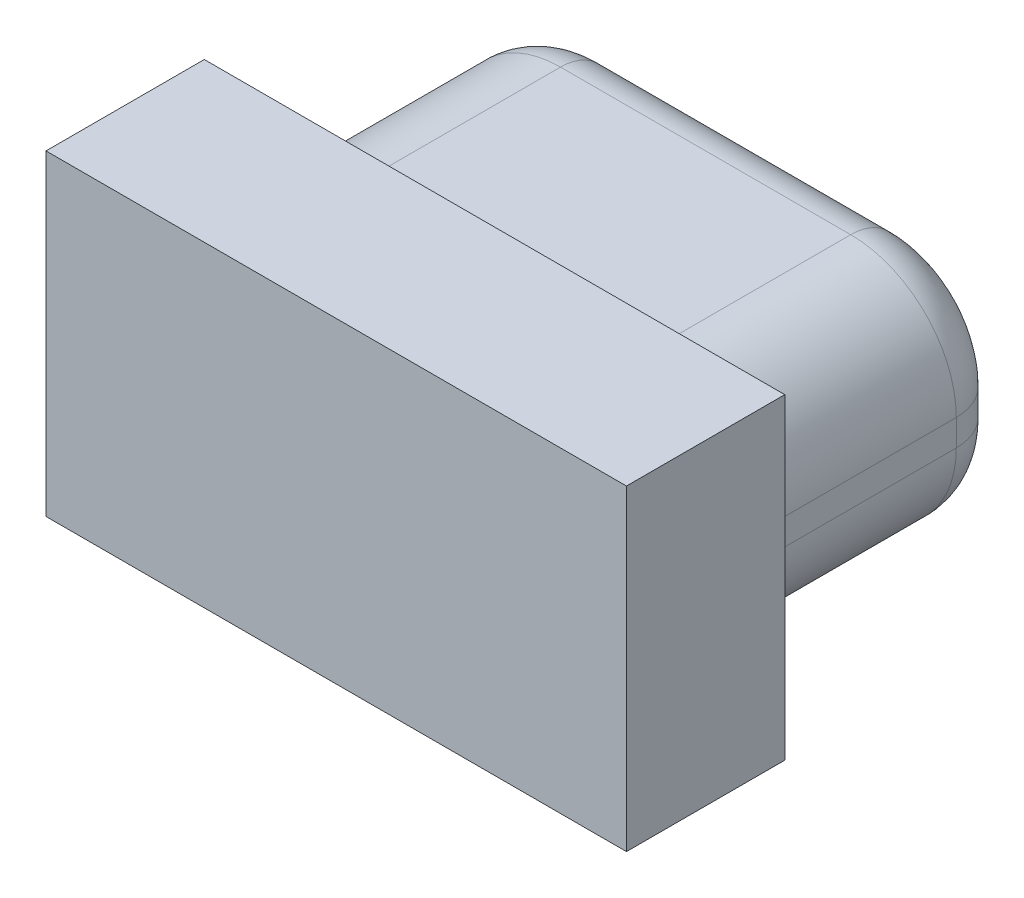
ISO-10303-21;
HEADER;
FILE_DESCRIPTION(('STEP AP214'),'2;1');
FILE_NAME('part.step','',(''),(''),'','','');
FILE_SCHEMA(('AUTOMOTIVE_DESIGN { 1 0 10303 214 1 1 1 1 }'));
ENDSEC;
DATA;
#1=APPLICATION_CONTEXT('core data for automotive mechanical design processes');
#2=APPLICATION_PROTOCOL_DEFINITION('international standard','automotive_design',2000,#1);
#3=PRODUCT_CONTEXT('',#1,'mechanical');
#4=PRODUCT('Part','Part','',(#3));
#5=PRODUCT_RELATED_PRODUCT_CATEGORY('part','',(#4));
#6=PRODUCT_DEFINITION_FORMATION('','',#4);
#7=PRODUCT_DEFINITION_CONTEXT('part definition',#1,'design');
#8=PRODUCT_DEFINITION('design','',#6,#7);
#9=PRODUCT_DEFINITION_SHAPE('','',#8);
#10=(LENGTH_UNIT() NAMED_UNIT(*) SI_UNIT(.MILLI.,.METRE.));
#11=(NAMED_UNIT(*) PLANE_ANGLE_UNIT() SI_UNIT($,.RADIAN.));
#12=(NAMED_UNIT(*) SI_UNIT($,.STERADIAN.) SOLID_ANGLE_UNIT());
#13=UNCERTAINTY_MEASURE_WITH_UNIT(LENGTH_MEASURE(1.E-05),#10,'distance_accuracy_value','');
#14=(GEOMETRIC_REPRESENTATION_CONTEXT(3) GLOBAL_UNCERTAINTY_ASSIGNED_CONTEXT((#13)) GLOBAL_UNIT_ASSIGNED_CONTEXT((#10,
#11,#12)) REPRESENTATION_CONTEXT('',''));
#15=CARTESIAN_POINT('',(0.,0.,0.));
#16=DIRECTION('',(0.,0.,1.));
#17=DIRECTION('',(1.,0.,0.));
#18=AXIS2_PLACEMENT_3D('',#15,#16,#17);
#19=CARTESIAN_POINT('',(0.,0.,5.));
#20=DIRECTION('',(1.,0.,0.));
#21=DIRECTION('',(0.,0.,-1.));
#22=AXIS2_PLACEMENT_3D('',#19,#20,#21);
#23=PLANE('',#22);
#24=DIRECTION('',(0.,0.,-1.));
#25=VECTOR('',#24,1.);
#26=CARTESIAN_POINT('',(0.,2.5,5.));
#27=LINE('',#26,#25);
#28=CARTESIAN_POINT('',(0.,2.5,5.));
#29=VERTEX_POINT('',#28);
#30=CARTESIAN_POINT('',(0.,2.5,1.));
#31=VERTEX_POINT('',#30);
#32=EDGE_CURVE('E195',#29,#31,#27,.T.);
#33=ORIENTED_EDGE('',*,*,#32,.T.);
#34=DIRECTION('',(0.,-1.,0.));
#35=VECTOR('',#34,1.);
#36=CARTESIAN_POINT('',(0.,2.,1.));
#37=LINE('',#36,#35);
#38=CARTESIAN_POINT('',(0.,2.,1.));
#39=VERTEX_POINT('',#38);
#40=EDGE_CURVE('E239',#31,#39,#37,.T.);
#41=ORIENTED_EDGE('',*,*,#40,.T.);
#42=DIRECTION('',(0.,0.,-1.));
#43=VECTOR('',#42,1.);
#44=CARTESIAN_POINT('',(0.,2.,5.));
#45=LINE('',#44,#43);
#46=CARTESIAN_POINT('',(0.,2.,5.));
#47=VERTEX_POINT('',#46);
#48=EDGE_CURVE('E193',#39,#47,#45,.F.);
#49=ORIENTED_EDGE('',*,*,#48,.T.);
#50=DIRECTION('',(0.,-1.,0.));
#51=VECTOR('',#50,1.);
#52=CARTESIAN_POINT('',(0.,0.,5.));
#53=LINE('',#52,#51);
#54=EDGE_CURVE('E176',#29,#47,#53,.T.);
#55=ORIENTED_EDGE('',*,*,#54,.F.);
#56=EDGE_LOOP('',(#33,#41,#49,#55));
#57=FACE_BOUND('',#56,.T.);
#58=ADVANCED_FACE('F37',(#57),#23,.F.);
#59=CARTESIAN_POINT('',(0.,0.,5.));
#60=DIRECTION('',(0.,1.,0.));
#61=DIRECTION('',(0.,0.,1.));
#62=AXIS2_PLACEMENT_3D('',#59,#60,#61);
#63=PLANE('',#62);
#64=DIRECTION('',(0.,0.,-1.));
#65=VECTOR('',#64,1.);
#66=CARTESIAN_POINT('',(2.,0.,5.));
#67=LINE('',#66,#65);
#68=CARTESIAN_POINT('',(2.,0.,5.));
#69=VERTEX_POINT('',#68);
#70=CARTESIAN_POINT('',(2.,0.,1.));
#71=VERTEX_POINT('',#70);
#72=EDGE_CURVE('E207',#69,#71,#67,.T.);
#73=ORIENTED_EDGE('',*,*,#72,.T.);
#74=DIRECTION('',(1.,0.,0.));
#75=VECTOR('',#74,1.);
#76=CARTESIAN_POINT('',(7.5,0.,1.));
#77=LINE('',#76,#75);
#78=CARTESIAN_POINT('',(7.5,0.,1.));
#79=VERTEX_POINT('',#78);
#80=EDGE_CURVE('E11',#71,#79,#77,.T.);
#81=ORIENTED_EDGE('',*,*,#80,.T.);
#82=DIRECTION('',(0.,0.,-1.));
#83=VECTOR('',#82,1.);
#84=CARTESIAN_POINT('',(7.5,0.,5.));
#85=LINE('',#84,#83);
#86=CARTESIAN_POINT('',(7.5,0.,5.));
#87=VERTEX_POINT('',#86);
#88=EDGE_CURVE('E209',#79,#87,#85,.F.);
#89=ORIENTED_EDGE('',*,*,#88,.T.);
#90=DIRECTION('',(1.,0.,0.));
#91=VECTOR('',#90,1.);
#92=CARTESIAN_POINT('',(0.,0.,5.));
#93=LINE('',#92,#91);
#94=EDGE_CURVE('E179',#69,#87,#93,.T.);
#95=ORIENTED_EDGE('',*,*,#94,.F.);
#96=EDGE_LOOP('',(#73,#81,#89,#95));
#97=FACE_BOUND('',#96,.T.);
#98=ADVANCED_FACE('F306',(#97),#63,.F.);
#99=CARTESIAN_POINT('',(9.5,0.,5.));
#100=DIRECTION('',(-1.,0.,0.));
#101=DIRECTION('',(0.,0.,1.));
#102=AXIS2_PLACEMENT_3D('',#99,#100,#101);
#103=PLANE('',#102);
#104=DIRECTION('',(0.,0.,-1.));
#105=VECTOR('',#104,1.);
#106=CARTESIAN_POINT('',(9.5,2.,5.));
#107=LINE('',#106,#105);
#108=CARTESIAN_POINT('',(9.5,2.,5.));
#109=VERTEX_POINT('',#108);
#110=CARTESIAN_POINT('',(9.5,2.,1.));
#111=VERTEX_POINT('',#110);
#112=EDGE_CURVE('E203',#109,#111,#107,.T.);
#113=ORIENTED_EDGE('',*,*,#112,.T.);
#114=DIRECTION('',(0.,1.,0.));
#115=VECTOR('',#114,1.);
#116=CARTESIAN_POINT('',(9.5,2.5,1.));
#117=LINE('',#116,#115);
#118=CARTESIAN_POINT('',(9.5,2.5,1.));
#119=VERTEX_POINT('',#118);
#120=EDGE_CURVE('E247',#111,#119,#117,.T.);
#121=ORIENTED_EDGE('',*,*,#120,.T.);
#122=DIRECTION('',(0.,0.,-1.));
#123=VECTOR('',#122,1.);
#124=CARTESIAN_POINT('',(9.5,2.5,5.));
#125=LINE('',#124,#123);
#126=CARTESIAN_POINT('',(9.5,2.5,5.));
#127=VERTEX_POINT('',#126);
#128=EDGE_CURVE('E205',#119,#127,#125,.F.);
#129=ORIENTED_EDGE('',*,*,#128,.T.);
#130=DIRECTION('',(0.,1.,0.));
#131=VECTOR('',#130,1.);
#132=CARTESIAN_POINT('',(9.5,0.,5.));
#133=LINE('',#132,#131);
#134=EDGE_CURVE('E187',#109,#127,#133,.T.);
#135=ORIENTED_EDGE('',*,*,#134,.F.);
#136=EDGE_LOOP('',(#113,#121,#129,#135));
#137=FACE_BOUND('',#136,.T.);
#138=ADVANCED_FACE('F312',(#137),#103,.F.);
#139=CARTESIAN_POINT('',(0.,4.5,5.));
#140=DIRECTION('',(0.,-1.,0.));
#141=DIRECTION('',(0.,0.,-1.));
#142=AXIS2_PLACEMENT_3D('',#139,#140,#141);
#143=PLANE('',#142);
#144=DIRECTION('',(0.,0.,-1.));
#145=VECTOR('',#144,1.);
#146=CARTESIAN_POINT('',(7.5,4.5,5.));
#147=LINE('',#146,#145);
#148=CARTESIAN_POINT('',(7.5,4.5,5.));
#149=VERTEX_POINT('',#148);
#150=CARTESIAN_POINT('',(7.5,4.5,1.));
#151=VERTEX_POINT('',#150);
#152=EDGE_CURVE('E198',#149,#151,#147,.T.);
#153=ORIENTED_EDGE('',*,*,#152,.T.);
#154=DIRECTION('',(-1.,0.,0.));
#155=VECTOR('',#154,1.);
#156=CARTESIAN_POINT('',(2.,4.5,1.));
#157=LINE('',#156,#155);
#158=CARTESIAN_POINT('',(2.,4.5,1.));
#159=VERTEX_POINT('',#158);
#160=EDGE_CURVE('E243',#151,#159,#157,.T.);
#161=ORIENTED_EDGE('',*,*,#160,.T.);
#162=DIRECTION('',(0.,0.,-1.));
#163=VECTOR('',#162,1.);
#164=CARTESIAN_POINT('',(2.,4.5,5.));
#165=LINE('',#164,#163);
#166=CARTESIAN_POINT('',(2.,4.5,5.));
#167=VERTEX_POINT('',#166);
#168=EDGE_CURVE('E201',#159,#167,#165,.F.);
#169=ORIENTED_EDGE('',*,*,#168,.T.);
#170=DIRECTION('',(-1.,0.,0.));
#171=VECTOR('',#170,1.);
#172=CARTESIAN_POINT('',(0.,4.5,5.));
#173=LINE('',#172,#171);
#174=EDGE_CURVE('E190',#149,#167,#173,.T.);
#175=ORIENTED_EDGE('',*,*,#174,.F.);
#176=EDGE_LOOP('',(#153,#161,#169,#175));
#177=FACE_BOUND('',#176,.T.);
#178=ADVANCED_FACE('F367',(#177),#143,.F.);
#179=CARTESIAN_POINT('',(0.,0.,0.));
#180=DIRECTION('',(0.,0.,-1.));
#181=DIRECTION('',(-1.,0.,0.));
#182=AXIS2_PLACEMENT_3D('',#179,#180,#181);
#183=PLANE('',#182);
#184=DIRECTION('',(1.,0.,0.));
#185=VECTOR('',#184,1.);
#186=CARTESIAN_POINT('',(2.,1.,0.));
#187=LINE('',#186,#185);
#188=CARTESIAN_POINT('',(7.5,1.,0.));
#189=VERTEX_POINT('',#188);
#190=CARTESIAN_POINT('',(2.,1.,0.));
#191=VERTEX_POINT('',#190);
#192=EDGE_CURVE('E219',#189,#191,#187,.F.);
#193=ORIENTED_EDGE('',*,*,#192,.T.);
#194=CARTESIAN_POINT('',(2.,2.,0.));
#195=DIRECTION('',(0.,0.,-1.));
#196=DIRECTION('',(-1.,0.,0.));
#197=AXIS2_PLACEMENT_3D('',#194,#195,#196);
#198=CIRCLE('',#197,1.);
#199=CARTESIAN_POINT('',(1.,2.,0.));
#200=VERTEX_POINT('',#199);
#201=EDGE_CURVE('E233',#191,#200,#198,.T.);
#202=ORIENTED_EDGE('',*,*,#201,.T.);
#203=DIRECTION('',(0.,-1.,0.));
#204=VECTOR('',#203,1.);
#205=CARTESIAN_POINT('',(1.,2.5,0.));
#206=LINE('',#205,#204);
#207=CARTESIAN_POINT('',(1.,2.5,0.));
#208=VERTEX_POINT('',#207);
#209=EDGE_CURVE('E231',#200,#208,#206,.F.);
#210=ORIENTED_EDGE('',*,*,#209,.T.);
#211=CARTESIAN_POINT('',(2.,2.5,0.));
#212=DIRECTION('',(0.,0.,-1.));
#213=DIRECTION('',(-1.,0.,0.));
#214=AXIS2_PLACEMENT_3D('',#211,#212,#213);
#215=CIRCLE('',#214,1.);
#216=CARTESIAN_POINT('',(2.,3.5,0.));
#217=VERTEX_POINT('',#216);
#218=EDGE_CURVE('E229',#208,#217,#215,.T.);
#219=ORIENTED_EDGE('',*,*,#218,.T.);
#220=DIRECTION('',(-1.,0.,0.));
#221=VECTOR('',#220,1.);
#222=CARTESIAN_POINT('',(7.5,3.5,0.));
#223=LINE('',#222,#221);
#224=CARTESIAN_POINT('',(7.5,3.5,0.));
#225=VERTEX_POINT('',#224);
#226=EDGE_CURVE('E227',#217,#225,#223,.F.);
#227=ORIENTED_EDGE('',*,*,#226,.T.);
#228=CARTESIAN_POINT('',(7.5,2.5,0.));
#229=DIRECTION('',(0.,0.,-1.));
#230=DIRECTION('',(-1.,0.,0.));
#231=AXIS2_PLACEMENT_3D('',#228,#229,#230);
#232=CIRCLE('',#231,1.);
#233=CARTESIAN_POINT('',(8.5,2.5,0.));
#234=VERTEX_POINT('',#233);
#235=EDGE_CURVE('E225',#225,#234,#232,.T.);
#236=ORIENTED_EDGE('',*,*,#235,.T.);
#237=DIRECTION('',(0.,1.,0.));
#238=VECTOR('',#237,1.);
#239=CARTESIAN_POINT('',(8.5,2.,0.));
#240=LINE('',#239,#238);
#241=CARTESIAN_POINT('',(8.5,2.,0.));
#242=VERTEX_POINT('',#241);
#243=EDGE_CURVE('E223',#234,#242,#240,.F.);
#244=ORIENTED_EDGE('',*,*,#243,.T.);
#245=CARTESIAN_POINT('',(7.5,2.,0.));
#246=DIRECTION('',(0.,0.,-1.));
#247=DIRECTION('',(-1.,0.,0.));
#248=AXIS2_PLACEMENT_3D('',#245,#246,#247);
#249=CIRCLE('',#248,1.);
#250=EDGE_CURVE('E221',#242,#189,#249,.T.);
#251=ORIENTED_EDGE('',*,*,#250,.T.);
#252=EDGE_LOOP('',(#193,#202,#210,#219,#227,#236,#244,#251));
#253=FACE_BOUND('',#252,.T.);
#254=ADVANCED_FACE('F385',(#253),#183,.T.);
#255=CARTESIAN_POINT('',(0.,0.,5.));
#256=DIRECTION('',(0.,0.,1.));
#257=DIRECTION('',(1.,0.,0.));
#258=AXIS2_PLACEMENT_3D('',#255,#256,#257);
#259=PLANE('',#258);
#260=DIRECTION('',(0.,-1.,0.));
#261=VECTOR('',#260,1.);
#262=CARTESIAN_POINT('',(-0.75,5.25,5.));
#263=LINE('',#262,#261);
#264=CARTESIAN_POINT('',(-0.75,5.25,5.));
#265=VERTEX_POINT('',#264);
#266=CARTESIAN_POINT('',(-0.749999999999999,-0.750000000000001,5.));
#267=VERTEX_POINT('',#266);
#268=EDGE_CURVE('E175',#265,#267,#263,.T.);
#269=ORIENTED_EDGE('',*,*,#268,.F.);
#270=DIRECTION('',(-1.,0.,0.));
#271=VECTOR('',#270,1.);
#272=CARTESIAN_POINT('',(-0.75,5.25,5.));
#273=LINE('',#272,#271);
#274=CARTESIAN_POINT('',(10.25,5.25,5.));
#275=VERTEX_POINT('',#274);
#276=EDGE_CURVE('E171',#275,#265,#273,.T.);
#277=ORIENTED_EDGE('',*,*,#276,.F.);
#278=DIRECTION('',(0.,1.,0.));
#279=VECTOR('',#278,1.);
#280=CARTESIAN_POINT('',(10.25,5.25,5.));
#281=LINE('',#280,#279);
#282=CARTESIAN_POINT('',(10.25,-0.750000000000001,5.));
#283=VERTEX_POINT('',#282);
#284=EDGE_CURVE('E278',#283,#275,#281,.T.);
#285=ORIENTED_EDGE('',*,*,#284,.F.);
#286=DIRECTION('',(1.,0.,0.));
#287=VECTOR('',#286,1.);
#288=CARTESIAN_POINT('',(-0.749999999999999,-0.750000000000001,5.));
#289=LINE('',#288,#287);
#290=EDGE_CURVE('E276',#267,#283,#289,.T.);
#291=ORIENTED_EDGE('',*,*,#290,.F.);
#292=EDGE_LOOP('',(#269,#277,#285,#291));
#293=FACE_BOUND('',#292,.T.);
#294=ORIENTED_EDGE('',*,*,#134,.T.);
#295=CARTESIAN_POINT('',(7.5,2.5,5.));
#296=DIRECTION('',(0.,0.,1.));
#297=DIRECTION('',(1.,0.,0.));
#298=AXIS2_PLACEMENT_3D('',#295,#296,#297);
#299=CIRCLE('',#298,2.);
#300=EDGE_CURVE('E213',#127,#149,#299,.T.);
#301=ORIENTED_EDGE('',*,*,#300,.T.);
#302=ORIENTED_EDGE('',*,*,#174,.T.);
#303=CARTESIAN_POINT('',(2.,2.5,5.));
#304=DIRECTION('',(0.,0.,1.));
#305=DIRECTION('',(1.,0.,0.));
#306=AXIS2_PLACEMENT_3D('',#303,#304,#305);
#307=CIRCLE('',#306,2.);
#308=EDGE_CURVE('E211',#167,#29,#307,.T.);
#309=ORIENTED_EDGE('',*,*,#308,.T.);
#310=ORIENTED_EDGE('',*,*,#54,.T.);
#311=CARTESIAN_POINT('',(2.,2.,5.));
#312=DIRECTION('',(0.,0.,1.));
#313=DIRECTION('',(1.,0.,0.));
#314=AXIS2_PLACEMENT_3D('',#311,#312,#313);
#315=CIRCLE('',#314,2.);
#316=EDGE_CURVE('E217',#47,#69,#315,.T.);
#317=ORIENTED_EDGE('',*,*,#316,.T.);
#318=ORIENTED_EDGE('',*,*,#94,.T.);
#319=CARTESIAN_POINT('',(7.5,2.,5.));
#320=DIRECTION('',(0.,0.,1.));
#321=DIRECTION('',(1.,0.,0.));
#322=AXIS2_PLACEMENT_3D('',#319,#320,#321);
#323=CIRCLE('',#322,2.);
#324=EDGE_CURVE('E215',#87,#109,#323,.T.);
#325=ORIENTED_EDGE('',*,*,#324,.T.);
#326=EDGE_LOOP('',(#294,#301,#302,#309,#310,#317,#318,#325));
#327=FACE_BOUND('',#326,.T.);
#328=ADVANCED_FACE('F294',(#293,#327),#259,.F.);
#329=CARTESIAN_POINT('',(-0.75,5.25,8.));
#330=DIRECTION('',(1.,0.,0.));
#331=DIRECTION('',(0.,1.,0.));
#332=AXIS2_PLACEMENT_3D('',#329,#330,#331);
#333=PLANE('',#332);
#334=ORIENTED_EDGE('',*,*,#268,.T.);
#335=DIRECTION('',(0.,0.,-1.));
#336=VECTOR('',#335,1.);
#337=CARTESIAN_POINT('',(-0.749999999999999,-0.750000000000001,8.));
#338=LINE('',#337,#336);
#339=CARTESIAN_POINT('',(-0.749999999999999,-0.750000000000001,8.));
#340=VERTEX_POINT('',#339);
#341=EDGE_CURVE('E155',#340,#267,#338,.T.);
#342=ORIENTED_EDGE('',*,*,#341,.F.);
#343=DIRECTION('',(0.,-1.,0.));
#344=VECTOR('',#343,1.);
#345=CARTESIAN_POINT('',(-0.75,5.25,8.));
#346=LINE('',#345,#344);
#347=CARTESIAN_POINT('',(-0.75,5.25,8.));
#348=VERTEX_POINT('',#347);
#349=EDGE_CURVE('E162',#348,#340,#346,.T.);
#350=ORIENTED_EDGE('',*,*,#349,.F.);
#351=DIRECTION('',(0.,0.,-1.));
#352=VECTOR('',#351,1.);
#353=CARTESIAN_POINT('',(-0.75,5.25,8.));
#354=LINE('',#353,#352);
#355=EDGE_CURVE('E285',#348,#265,#354,.T.);
#356=ORIENTED_EDGE('',*,*,#355,.T.);
#357=EDGE_LOOP('',(#334,#342,#350,#356));
#358=FACE_BOUND('',#357,.T.);
#359=ADVANCED_FACE('F173',(#358),#333,.F.);
#360=CARTESIAN_POINT('',(-0.749999999999999,-0.750000000000001,8.));
#361=DIRECTION('',(0.,1.,0.));
#362=DIRECTION('',(0.,0.,1.));
#363=AXIS2_PLACEMENT_3D('',#360,#361,#362);
#364=PLANE('',#363);
#365=ORIENTED_EDGE('',*,*,#290,.T.);
#366=DIRECTION('',(0.,0.,-1.));
#367=VECTOR('',#366,1.);
#368=CARTESIAN_POINT('',(10.25,-0.750000000000001,8.));
#369=LINE('',#368,#367);
#370=CARTESIAN_POINT('',(10.25,-0.750000000000001,8.));
#371=VERTEX_POINT('',#370);
#372=EDGE_CURVE('E158',#371,#283,#369,.T.);
#373=ORIENTED_EDGE('',*,*,#372,.F.);
#374=DIRECTION('',(1.,0.,0.));
#375=VECTOR('',#374,1.);
#376=CARTESIAN_POINT('',(-0.749999999999999,-0.750000000000001,8.));
#377=LINE('',#376,#375);
#378=EDGE_CURVE('E151',#340,#371,#377,.T.);
#379=ORIENTED_EDGE('',*,*,#378,.F.);
#380=ORIENTED_EDGE('',*,*,#341,.T.);
#381=EDGE_LOOP('',(#365,#373,#379,#380));
#382=FACE_BOUND('',#381,.T.);
#383=ADVANCED_FACE('F153',(#382),#364,.F.);
#384=CARTESIAN_POINT('',(10.25,5.25,8.));
#385=DIRECTION('',(-1.,0.,0.));
#386=DIRECTION('',(0.,0.,1.));
#387=AXIS2_PLACEMENT_3D('',#384,#385,#386);
#388=PLANE('',#387);
#389=ORIENTED_EDGE('',*,*,#284,.T.);
#390=DIRECTION('',(0.,0.,-1.));
#391=VECTOR('',#390,1.);
#392=CARTESIAN_POINT('',(10.25,5.25,8.));
#393=LINE('',#392,#391);
#394=CARTESIAN_POINT('',(10.25,5.25,8.));
#395=VERTEX_POINT('',#394);
#396=EDGE_CURVE('E181',#395,#275,#393,.T.);
#397=ORIENTED_EDGE('',*,*,#396,.F.);
#398=DIRECTION('',(0.,1.,0.));
#399=VECTOR('',#398,1.);
#400=CARTESIAN_POINT('',(10.25,5.25,8.));
#401=LINE('',#400,#399);
#402=EDGE_CURVE('E161',#371,#395,#401,.T.);
#403=ORIENTED_EDGE('',*,*,#402,.F.);
#404=ORIENTED_EDGE('',*,*,#372,.T.);
#405=EDGE_LOOP('',(#389,#397,#403,#404));
#406=FACE_BOUND('',#405,.T.);
#407=ADVANCED_FACE('F296',(#406),#388,.F.);
#408=CARTESIAN_POINT('',(-0.75,5.25,8.));
#409=DIRECTION('',(0.,-1.,0.));
#410=DIRECTION('',(0.,0.,-1.));
#411=AXIS2_PLACEMENT_3D('',#408,#409,#410);
#412=PLANE('',#411);
#413=ORIENTED_EDGE('',*,*,#276,.T.);
#414=ORIENTED_EDGE('',*,*,#355,.F.);
#415=DIRECTION('',(-1.,0.,0.));
#416=VECTOR('',#415,1.);
#417=CARTESIAN_POINT('',(-0.75,5.25,8.));
#418=LINE('',#417,#416);
#419=EDGE_CURVE('E167',#395,#348,#418,.T.);
#420=ORIENTED_EDGE('',*,*,#419,.F.);
#421=ORIENTED_EDGE('',*,*,#396,.T.);
#422=EDGE_LOOP('',(#413,#414,#420,#421));
#423=FACE_BOUND('',#422,.T.);
#424=ADVANCED_FACE('F290',(#423),#412,.F.);
#425=CARTESIAN_POINT('',(0.,0.,8.));
#426=DIRECTION('',(0.,0.,1.));
#427=DIRECTION('',(1.,0.,0.));
#428=AXIS2_PLACEMENT_3D('',#425,#426,#427);
#429=PLANE('',#428);
#430=ORIENTED_EDGE('',*,*,#349,.T.);
#431=ORIENTED_EDGE('',*,*,#378,.T.);
#432=ORIENTED_EDGE('',*,*,#402,.T.);
#433=ORIENTED_EDGE('',*,*,#419,.T.);
#434=EDGE_LOOP('',(#430,#431,#432,#433));
#435=FACE_BOUND('',#434,.T.);
#436=ADVANCED_FACE('F165',(#435),#429,.T.);
#437=CARTESIAN_POINT('',(2.,2.5,5.));
#438=DIRECTION('',(0.,0.,-1.));
#439=DIRECTION('',(-1.,0.,0.));
#440=AXIS2_PLACEMENT_3D('',#437,#438,#439);
#441=CYLINDRICAL_SURFACE('',#440,2.);
#442=ORIENTED_EDGE('',*,*,#168,.F.);
#443=CARTESIAN_POINT('',(2.,2.5,1.));
#444=DIRECTION('',(0.,0.,-1.));
#445=DIRECTION('',(-1.,0.,0.));
#446=AXIS2_PLACEMENT_3D('',#443,#444,#445);
#447=CIRCLE('',#446,2.);
#448=EDGE_CURVE('E241',#159,#31,#447,.F.);
#449=ORIENTED_EDGE('',*,*,#448,.T.);
#450=ORIENTED_EDGE('',*,*,#32,.F.);
#451=ORIENTED_EDGE('',*,*,#308,.F.);
#452=EDGE_LOOP('',(#442,#449,#450,#451));
#453=FACE_BOUND('',#452,.T.);
#454=ADVANCED_FACE('F316',(#453),#441,.T.);
#455=CARTESIAN_POINT('',(7.5,2.5,5.));
#456=DIRECTION('',(0.,0.,-1.));
#457=DIRECTION('',(-1.,0.,0.));
#458=AXIS2_PLACEMENT_3D('',#455,#456,#457);
#459=CYLINDRICAL_SURFACE('',#458,2.);
#460=ORIENTED_EDGE('',*,*,#128,.F.);
#461=CARTESIAN_POINT('',(7.5,2.5,1.));
#462=DIRECTION('',(0.,0.,-1.));
#463=DIRECTION('',(-1.,0.,0.));
#464=AXIS2_PLACEMENT_3D('',#461,#462,#463);
#465=CIRCLE('',#464,2.);
#466=EDGE_CURVE('E245',#119,#151,#465,.F.);
#467=ORIENTED_EDGE('',*,*,#466,.T.);
#468=ORIENTED_EDGE('',*,*,#152,.F.);
#469=ORIENTED_EDGE('',*,*,#300,.F.);
#470=EDGE_LOOP('',(#460,#467,#468,#469));
#471=FACE_BOUND('',#470,.T.);
#472=ADVANCED_FACE('F319',(#471),#459,.T.);
#473=CARTESIAN_POINT('',(7.5,2.,5.));
#474=DIRECTION('',(0.,0.,-1.));
#475=DIRECTION('',(-1.,0.,0.));
#476=AXIS2_PLACEMENT_3D('',#473,#474,#475);
#477=CYLINDRICAL_SURFACE('',#476,2.);
#478=ORIENTED_EDGE('',*,*,#88,.F.);
#479=CARTESIAN_POINT('',(7.5,2.,1.));
#480=DIRECTION('',(0.,0.,-1.));
#481=DIRECTION('',(-1.,0.,0.));
#482=AXIS2_PLACEMENT_3D('',#479,#480,#481);
#483=CIRCLE('',#482,2.);
#484=EDGE_CURVE('E46',#79,#111,#483,.F.);
#485=ORIENTED_EDGE('',*,*,#484,.T.);
#486=ORIENTED_EDGE('',*,*,#112,.F.);
#487=ORIENTED_EDGE('',*,*,#324,.F.);
#488=EDGE_LOOP('',(#478,#485,#486,#487));
#489=FACE_BOUND('',#488,.T.);
#490=ADVANCED_FACE('F323',(#489),#477,.T.);
#491=CARTESIAN_POINT('',(2.,2.,5.));
#492=DIRECTION('',(0.,0.,-1.));
#493=DIRECTION('',(-1.,0.,0.));
#494=AXIS2_PLACEMENT_3D('',#491,#492,#493);
#495=CYLINDRICAL_SURFACE('',#494,2.);
#496=ORIENTED_EDGE('',*,*,#48,.F.);
#497=CARTESIAN_POINT('',(2.,2.,1.));
#498=DIRECTION('',(0.,0.,-1.));
#499=DIRECTION('',(-1.,0.,0.));
#500=AXIS2_PLACEMENT_3D('',#497,#498,#499);
#501=CIRCLE('',#500,2.);
#502=EDGE_CURVE('E236',#39,#71,#501,.F.);
#503=ORIENTED_EDGE('',*,*,#502,.T.);
#504=ORIENTED_EDGE('',*,*,#72,.F.);
#505=ORIENTED_EDGE('',*,*,#316,.F.);
#506=EDGE_LOOP('',(#496,#503,#504,#505));
#507=FACE_BOUND('',#506,.T.);
#508=ADVANCED_FACE('F327',(#507),#495,.T.);
#509=CARTESIAN_POINT('',(7.5,2.5,1.));
#510=DIRECTION('',(0.,0.,-1.));
#511=DIRECTION('',(-1.,0.,0.));
#512=AXIS2_PLACEMENT_3D('',#509,#510,#511);
#513=DEGENERATE_TOROIDAL_SURFACE('',#512,1.,1.,.T.);
#514=CARTESIAN_POINT('',(7.5,3.5,1.));
#515=DIRECTION('',(-1.,0.,0.));
#516=DIRECTION('',(0.,0.,1.));
#517=AXIS2_PLACEMENT_3D('',#514,#515,#516);
#518=CIRCLE('',#517,1.);
#519=EDGE_CURVE('E265',#151,#225,#518,.T.);
#520=ORIENTED_EDGE('',*,*,#519,.F.);
#521=ORIENTED_EDGE('',*,*,#466,.F.);
#522=CARTESIAN_POINT('',(8.5,2.5,1.));
#523=DIRECTION('',(0.,-1.,0.));
#524=DIRECTION('',(0.,0.,-1.));
#525=AXIS2_PLACEMENT_3D('',#522,#523,#524);
#526=CIRCLE('',#525,1.);
#527=EDGE_CURVE('E41',#234,#119,#526,.T.);
#528=ORIENTED_EDGE('',*,*,#527,.F.);
#529=ORIENTED_EDGE('',*,*,#235,.F.);
#530=EDGE_LOOP('',(#520,#521,#528,#529));
#531=FACE_BOUND('',#530,.T.);
#532=ADVANCED_FACE('F39',(#531),#513,.T.);
#533=CARTESIAN_POINT('',(8.5,0.,1.));
#534=DIRECTION('',(0.,-1.,0.));
#535=DIRECTION('',(0.,0.,-1.));
#536=AXIS2_PLACEMENT_3D('',#533,#534,#535);
#537=CYLINDRICAL_SURFACE('',#536,1.);
#538=ORIENTED_EDGE('',*,*,#527,.T.);
#539=ORIENTED_EDGE('',*,*,#120,.F.);
#540=CARTESIAN_POINT('',(8.5,2.,1.));
#541=DIRECTION('',(0.,-1.,0.));
#542=DIRECTION('',(0.,0.,-1.));
#543=AXIS2_PLACEMENT_3D('',#540,#541,#542);
#544=CIRCLE('',#543,1.);
#545=EDGE_CURVE('E263',#242,#111,#544,.T.);
#546=ORIENTED_EDGE('',*,*,#545,.F.);
#547=ORIENTED_EDGE('',*,*,#243,.F.);
#548=EDGE_LOOP('',(#538,#539,#546,#547));
#549=FACE_BOUND('',#548,.T.);
#550=ADVANCED_FACE('F353',(#549),#537,.T.);
#551=CARTESIAN_POINT('',(0.,3.5,1.));
#552=DIRECTION('',(1.,0.,0.));
#553=DIRECTION('',(0.,0.,-1.));
#554=AXIS2_PLACEMENT_3D('',#551,#552,#553);
#555=CYLINDRICAL_SURFACE('',#554,1.);
#556=ORIENTED_EDGE('',*,*,#519,.T.);
#557=ORIENTED_EDGE('',*,*,#226,.F.);
#558=CARTESIAN_POINT('',(2.,3.5,1.));
#559=DIRECTION('',(-1.,0.,0.));
#560=DIRECTION('',(0.,0.,1.));
#561=AXIS2_PLACEMENT_3D('',#558,#559,#560);
#562=CIRCLE('',#561,1.);
#563=EDGE_CURVE('E260',#159,#217,#562,.T.);
#564=ORIENTED_EDGE('',*,*,#563,.F.);
#565=ORIENTED_EDGE('',*,*,#160,.F.);
#566=EDGE_LOOP('',(#556,#557,#564,#565));
#567=FACE_BOUND('',#566,.T.);
#568=ADVANCED_FACE('F350',(#567),#555,.T.);
#569=CARTESIAN_POINT('',(7.5,2.,1.));
#570=DIRECTION('',(0.,0.,-1.));
#571=DIRECTION('',(-1.,0.,0.));
#572=AXIS2_PLACEMENT_3D('',#569,#570,#571);
#573=DEGENERATE_TOROIDAL_SURFACE('',#572,1.,1.,.T.);
#574=ORIENTED_EDGE('',*,*,#545,.T.);
#575=ORIENTED_EDGE('',*,*,#484,.F.);
#576=CARTESIAN_POINT('',(7.5,1.,1.));
#577=DIRECTION('',(-1.,0.,0.));
#578=DIRECTION('',(0.,0.,1.));
#579=AXIS2_PLACEMENT_3D('',#576,#577,#578);
#580=CIRCLE('',#579,1.);
#581=EDGE_CURVE('E257',#189,#79,#580,.T.);
#582=ORIENTED_EDGE('',*,*,#581,.F.);
#583=ORIENTED_EDGE('',*,*,#250,.F.);
#584=EDGE_LOOP('',(#574,#575,#582,#583));
#585=FACE_BOUND('',#584,.T.);
#586=ADVANCED_FACE('F346',(#585),#573,.T.);
#587=CARTESIAN_POINT('',(2.,2.5,1.));
#588=DIRECTION('',(0.,0.,-1.));
#589=DIRECTION('',(-1.,0.,0.));
#590=AXIS2_PLACEMENT_3D('',#587,#588,#589);
#591=DEGENERATE_TOROIDAL_SURFACE('',#590,1.,1.,.T.);
#592=ORIENTED_EDGE('',*,*,#563,.T.);
#593=ORIENTED_EDGE('',*,*,#218,.F.);
#594=CARTESIAN_POINT('',(1.,2.5,1.));
#595=DIRECTION('',(0.,-1.,0.));
#596=DIRECTION('',(0.,0.,-1.));
#597=AXIS2_PLACEMENT_3D('',#594,#595,#596);
#598=CIRCLE('',#597,1.);
#599=EDGE_CURVE('E254',#31,#208,#598,.T.);
#600=ORIENTED_EDGE('',*,*,#599,.F.);
#601=ORIENTED_EDGE('',*,*,#448,.F.);
#602=EDGE_LOOP('',(#592,#593,#600,#601));
#603=FACE_BOUND('',#602,.T.);
#604=ADVANCED_FACE('F342',(#603),#591,.T.);
#605=CARTESIAN_POINT('',(0.,1.,1.));
#606=DIRECTION('',(-1.,0.,0.));
#607=DIRECTION('',(0.,0.,1.));
#608=AXIS2_PLACEMENT_3D('',#605,#606,#607);
#609=CYLINDRICAL_SURFACE('',#608,1.);
#610=ORIENTED_EDGE('',*,*,#581,.T.);
#611=ORIENTED_EDGE('',*,*,#80,.F.);
#612=CARTESIAN_POINT('',(2.,1.,1.));
#613=DIRECTION('',(-1.,0.,0.));
#614=DIRECTION('',(0.,0.,1.));
#615=AXIS2_PLACEMENT_3D('',#612,#613,#614);
#616=CIRCLE('',#615,1.);
#617=EDGE_CURVE('E252',#191,#71,#616,.T.);
#618=ORIENTED_EDGE('',*,*,#617,.F.);
#619=ORIENTED_EDGE('',*,*,#192,.F.);
#620=EDGE_LOOP('',(#610,#611,#618,#619));
#621=FACE_BOUND('',#620,.T.);
#622=ADVANCED_FACE('F338',(#621),#609,.T.);
#623=CARTESIAN_POINT('',(1.,0.,1.));
#624=DIRECTION('',(0.,1.,0.));
#625=DIRECTION('',(0.,0.,1.));
#626=AXIS2_PLACEMENT_3D('',#623,#624,#625);
#627=CYLINDRICAL_SURFACE('',#626,1.);
#628=ORIENTED_EDGE('',*,*,#599,.T.);
#629=ORIENTED_EDGE('',*,*,#209,.F.);
#630=CARTESIAN_POINT('',(1.,2.,1.));
#631=DIRECTION('',(0.,-1.,0.));
#632=DIRECTION('',(0.,0.,-1.));
#633=AXIS2_PLACEMENT_3D('',#630,#631,#632);
#634=CIRCLE('',#633,1.);
#635=EDGE_CURVE('E250',#39,#200,#634,.T.);
#636=ORIENTED_EDGE('',*,*,#635,.F.);
#637=ORIENTED_EDGE('',*,*,#40,.F.);
#638=EDGE_LOOP('',(#628,#629,#636,#637));
#639=FACE_BOUND('',#638,.T.);
#640=ADVANCED_FACE('F334',(#639),#627,.T.);
#641=CARTESIAN_POINT('',(2.,2.,1.));
#642=DIRECTION('',(0.,0.,-1.));
#643=DIRECTION('',(-1.,0.,0.));
#644=AXIS2_PLACEMENT_3D('',#641,#642,#643);
#645=DEGENERATE_TOROIDAL_SURFACE('',#644,1.,1.,.T.);
#646=ORIENTED_EDGE('',*,*,#617,.T.);
#647=ORIENTED_EDGE('',*,*,#502,.F.);
#648=ORIENTED_EDGE('',*,*,#635,.T.);
#649=ORIENTED_EDGE('',*,*,#201,.F.);
#650=EDGE_LOOP('',(#646,#647,#648,#649));
#651=FACE_BOUND('',#650,.T.);
#652=ADVANCED_FACE('F331',(#651),#645,.T.);
#653=CLOSED_SHELL('',(#58,#98,#138,#178,#254,#328,#359,#383,#407,#424,#436,#454,#472,#490,#508,
#532,#550,#568,#586,#604,#622,#640,#652));
#654=MANIFOLD_SOLID_BREP('B2',#653);
#655=ADVANCED_BREP_SHAPE_REPRESENTATION('',(#18,#654),#14);
#656=SHAPE_DEFINITION_REPRESENTATION(#9,#655);
ENDSEC;
END-ISO-10303-21;
